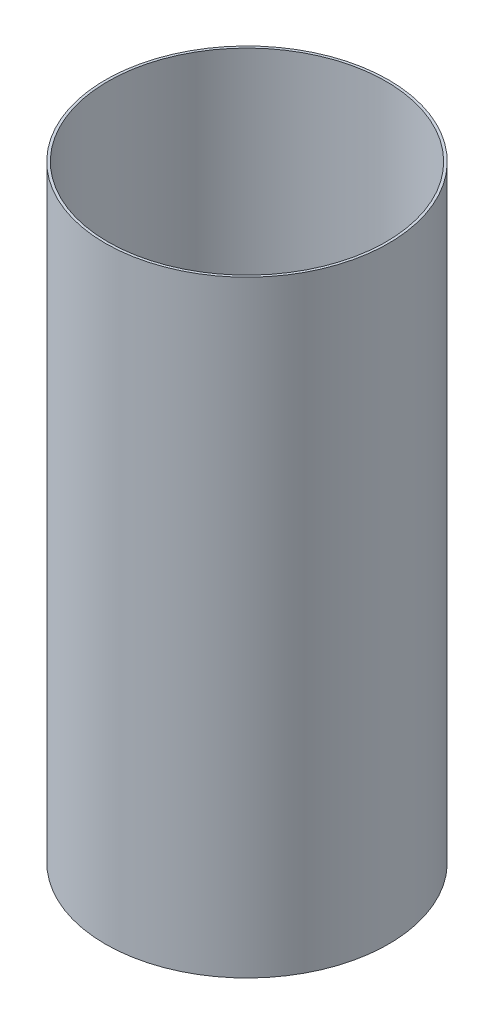
ISO-10303-21;
HEADER;
FILE_DESCRIPTION(('STEP AP214'),'2;1');
FILE_NAME('part.step','',(''),(''),'','','');
FILE_SCHEMA(('AUTOMOTIVE_DESIGN { 1 0 10303 214 1 1 1 1 }'));
ENDSEC;
DATA;
#1=APPLICATION_CONTEXT('core data for automotive mechanical design processes');
#2=APPLICATION_PROTOCOL_DEFINITION('international standard','automotive_design',2000,#1);
#3=PRODUCT_CONTEXT('',#1,'mechanical');
#4=PRODUCT('Part','Part','',(#3));
#5=PRODUCT_RELATED_PRODUCT_CATEGORY('part','',(#4));
#6=PRODUCT_DEFINITION_FORMATION('','',#4);
#7=PRODUCT_DEFINITION_CONTEXT('part definition',#1,'design');
#8=PRODUCT_DEFINITION('design','',#6,#7);
#9=PRODUCT_DEFINITION_SHAPE('','',#8);
#10=(LENGTH_UNIT() NAMED_UNIT(*) SI_UNIT(.MILLI.,.METRE.));
#11=(NAMED_UNIT(*) PLANE_ANGLE_UNIT() SI_UNIT($,.RADIAN.));
#12=(NAMED_UNIT(*) SI_UNIT($,.STERADIAN.) SOLID_ANGLE_UNIT());
#13=UNCERTAINTY_MEASURE_WITH_UNIT(LENGTH_MEASURE(1.E-05),#10,'distance_accuracy_value','');
#14=(GEOMETRIC_REPRESENTATION_CONTEXT(3) GLOBAL_UNCERTAINTY_ASSIGNED_CONTEXT((#13)) GLOBAL_UNIT_ASSIGNED_CONTEXT((#10,
#11,#12)) REPRESENTATION_CONTEXT('',''));
#15=CARTESIAN_POINT('',(0.,0.,0.));
#16=DIRECTION('',(0.,0.,1.));
#17=DIRECTION('',(1.,0.,0.));
#18=AXIS2_PLACEMENT_3D('',#15,#16,#17);
#19=CARTESIAN_POINT('',(0.,2400.,0.));
#20=DIRECTION('',(0.,1.,0.));
#21=DIRECTION('',(0.,0.,1.));
#22=AXIS2_PLACEMENT_3D('',#19,#20,#21);
#23=PLANE('',#22);
#24=CARTESIAN_POINT('',(0.,2400.,0.));
#25=DIRECTION('',(0.,1.,0.));
#26=DIRECTION('',(0.,0.,1.));
#27=AXIS2_PLACEMENT_3D('',#24,#25,#26);
#28=CIRCLE('',#27,560.);
#29=CARTESIAN_POINT('',(0.,2400.,560.));
#30=VERTEX_POINT('',#29);
#31=EDGE_CURVE('E10',#30,#30,#28,.T.);
#32=ORIENTED_EDGE('',*,*,#31,.T.);
#33=EDGE_LOOP('',(#32));
#34=FACE_BOUND('',#33,.T.);
#35=CARTESIAN_POINT('',(0.,2400.,0.));
#36=DIRECTION('',(0.,1.,0.));
#37=DIRECTION('',(0.,0.,1.));
#38=AXIS2_PLACEMENT_3D('',#35,#36,#37);
#39=CIRCLE('',#38,550.);
#40=CARTESIAN_POINT('',(0.,2400.,550.));
#41=VERTEX_POINT('',#40);
#42=EDGE_CURVE('E56',#41,#41,#39,.T.);
#43=ORIENTED_EDGE('',*,*,#42,.F.);
#44=EDGE_LOOP('',(#43));
#45=FACE_BOUND('',#44,.T.);
#46=ADVANCED_FACE('F43',(#34,#45),#23,.T.);
#47=CARTESIAN_POINT('',(0.,0.,0.));
#48=DIRECTION('',(0.,1.,0.));
#49=DIRECTION('',(0.,0.,1.));
#50=AXIS2_PLACEMENT_3D('',#47,#48,#49);
#51=PLANE('',#50);
#52=CARTESIAN_POINT('',(0.,0.,0.));
#53=DIRECTION('',(0.,1.,0.));
#54=DIRECTION('',(0.,0.,1.));
#55=AXIS2_PLACEMENT_3D('',#52,#53,#54);
#56=CIRCLE('',#55,560.);
#57=CARTESIAN_POINT('',(0.,0.,560.));
#58=VERTEX_POINT('',#57);
#59=EDGE_CURVE('E47',#58,#58,#56,.T.);
#60=ORIENTED_EDGE('',*,*,#59,.F.);
#61=EDGE_LOOP('',(#60));
#62=FACE_BOUND('',#61,.T.);
#63=CARTESIAN_POINT('',(0.,0.,0.));
#64=DIRECTION('',(0.,1.,0.));
#65=DIRECTION('',(0.,0.,1.));
#66=AXIS2_PLACEMENT_3D('',#63,#64,#65);
#67=CIRCLE('',#66,550.);
#68=CARTESIAN_POINT('',(0.,0.,550.));
#69=VERTEX_POINT('',#68);
#70=EDGE_CURVE('E58',#69,#69,#67,.T.);
#71=ORIENTED_EDGE('',*,*,#70,.T.);
#72=EDGE_LOOP('',(#71));
#73=FACE_BOUND('',#72,.T.);
#74=ADVANCED_FACE('F70',(#62,#73),#51,.F.);
#75=CARTESIAN_POINT('',(0.,2400.,0.));
#76=DIRECTION('',(0.,-1.,0.));
#77=DIRECTION('',(0.,0.,-1.));
#78=AXIS2_PLACEMENT_3D('',#75,#76,#77);
#79=CYLINDRICAL_SURFACE('',#78,560.);
#80=ORIENTED_EDGE('',*,*,#31,.F.);
#81=EDGE_LOOP('',(#80));
#82=FACE_BOUND('',#81,.T.);
#83=ORIENTED_EDGE('',*,*,#59,.T.);
#84=EDGE_LOOP('',(#83));
#85=FACE_BOUND('',#84,.T.);
#86=ADVANCED_FACE('F45',(#82,#85),#79,.T.);
#87=CARTESIAN_POINT('',(0.,2400.,0.));
#88=DIRECTION('',(0.,-1.,0.));
#89=DIRECTION('',(0.,0.,-1.));
#90=AXIS2_PLACEMENT_3D('',#87,#88,#89);
#91=CYLINDRICAL_SURFACE('',#90,550.);
#92=ORIENTED_EDGE('',*,*,#42,.T.);
#93=EDGE_LOOP('',(#92));
#94=FACE_BOUND('',#93,.T.);
#95=ORIENTED_EDGE('',*,*,#70,.F.);
#96=EDGE_LOOP('',(#95));
#97=FACE_BOUND('',#96,.T.);
#98=ADVANCED_FACE('F66',(#94,#97),#91,.F.);
#99=CLOSED_SHELL('',(#46,#74,#86,#98));
#100=MANIFOLD_SOLID_BREP('B2',#99);
#101=ADVANCED_BREP_SHAPE_REPRESENTATION('',(#18,#100),#14);
#102=SHAPE_DEFINITION_REPRESENTATION(#9,#101);
ENDSEC;
END-ISO-10303-21;
